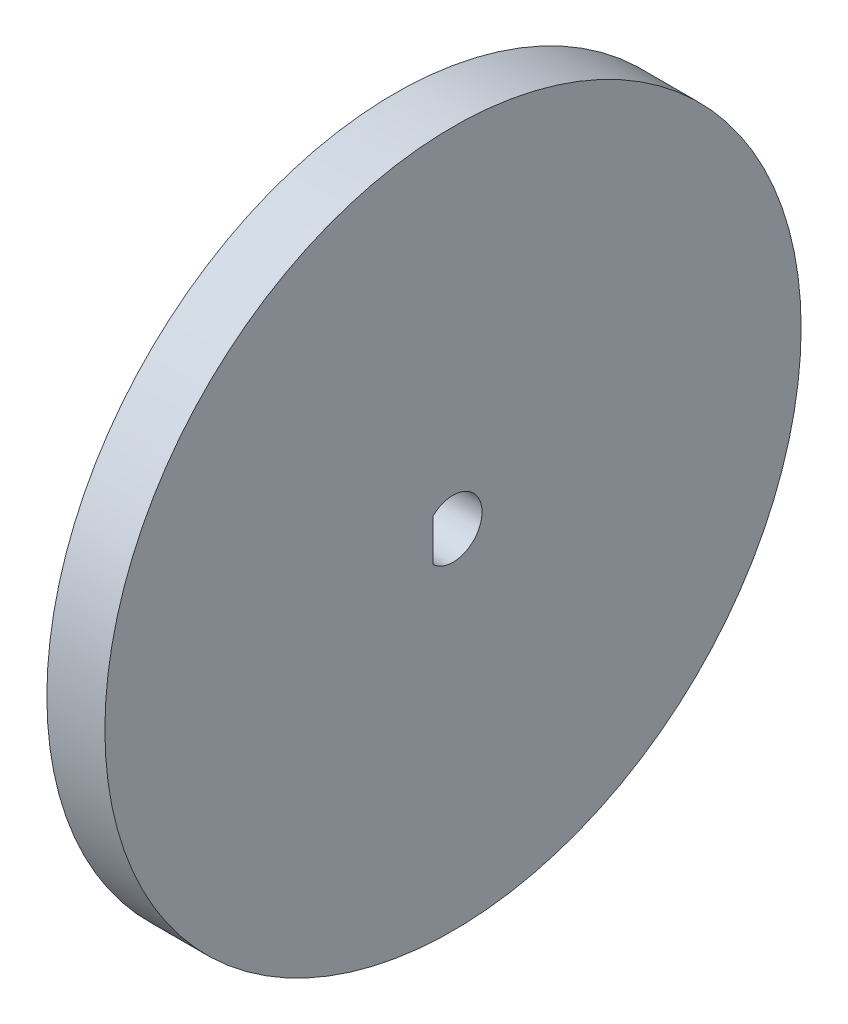
ISO-10303-21;
HEADER;
FILE_DESCRIPTION(('STEP AP214'),'2;1');
FILE_NAME('part.step','',(''),(''),'','','');
FILE_SCHEMA(('AUTOMOTIVE_DESIGN { 1 0 10303 214 1 1 1 1 }'));
ENDSEC;
DATA;
#1=APPLICATION_CONTEXT('core data for automotive mechanical design processes');
#2=APPLICATION_PROTOCOL_DEFINITION('international standard','automotive_design',2000,#1);
#3=PRODUCT_CONTEXT('',#1,'mechanical');
#4=PRODUCT('Part','Part','',(#3));
#5=PRODUCT_RELATED_PRODUCT_CATEGORY('part','',(#4));
#6=PRODUCT_DEFINITION_FORMATION('','',#4);
#7=PRODUCT_DEFINITION_CONTEXT('part definition',#1,'design');
#8=PRODUCT_DEFINITION('design','',#6,#7);
#9=PRODUCT_DEFINITION_SHAPE('','',#8);
#10=(LENGTH_UNIT() NAMED_UNIT(*) SI_UNIT(.MILLI.,.METRE.));
#11=(NAMED_UNIT(*) PLANE_ANGLE_UNIT() SI_UNIT($,.RADIAN.));
#12=(NAMED_UNIT(*) SI_UNIT($,.STERADIAN.) SOLID_ANGLE_UNIT());
#13=UNCERTAINTY_MEASURE_WITH_UNIT(LENGTH_MEASURE(1.E-05),#10,'distance_accuracy_value','');
#14=(GEOMETRIC_REPRESENTATION_CONTEXT(3) GLOBAL_UNCERTAINTY_ASSIGNED_CONTEXT((#13)) GLOBAL_UNIT_ASSIGNED_CONTEXT((#10,
#11,#12)) REPRESENTATION_CONTEXT('',''));
#15=CARTESIAN_POINT('',(0.,0.,0.));
#16=DIRECTION('',(0.,0.,1.));
#17=DIRECTION('',(1.,0.,0.));
#18=AXIS2_PLACEMENT_3D('',#15,#16,#17);
#19=CARTESIAN_POINT('',(6.35,0.,0.));
#20=DIRECTION('',(1.,0.,0.));
#21=DIRECTION('',(0.,0.,-1.));
#22=AXIS2_PLACEMENT_3D('',#19,#20,#21);
#23=PLANE('',#22);
#24=CARTESIAN_POINT('',(6.35,0.,0.));
#25=DIRECTION('',(1.,0.,0.));
#26=DIRECTION('',(0.,0.,-1.));
#27=AXIS2_PLACEMENT_3D('',#24,#25,#26);
#28=CIRCLE('',#27,38.1);
#29=CARTESIAN_POINT('',(6.35,0.,-38.1));
#30=VERTEX_POINT('',#29);
#31=EDGE_CURVE('E11',#30,#30,#28,.T.);
#32=ORIENTED_EDGE('',*,*,#31,.T.);
#33=EDGE_LOOP('',(#32));
#34=FACE_BOUND('',#33,.T.);
#35=DIRECTION('',(0.,-1.,0.));
#36=VECTOR('',#35,1.);
#37=CARTESIAN_POINT('',(6.35,2.30413142854309,2.1844));
#38=LINE('',#37,#36);
#39=CARTESIAN_POINT('',(6.35,2.30413142854309,2.1844));
#40=VERTEX_POINT('',#39);
#41=CARTESIAN_POINT('',(6.35,-2.30413142854309,2.1844));
#42=VERTEX_POINT('',#41);
#43=EDGE_CURVE('E74',#40,#42,#38,.T.);
#44=ORIENTED_EDGE('',*,*,#43,.F.);
#45=CARTESIAN_POINT('',(6.35,0.,0.));
#46=DIRECTION('',(1.,0.,0.));
#47=DIRECTION('',(0.,0.,-1.));
#48=AXIS2_PLACEMENT_3D('',#45,#46,#47);
#49=CIRCLE('',#48,3.175);
#50=EDGE_CURVE('E65',#42,#40,#49,.T.);
#51=ORIENTED_EDGE('',*,*,#50,.F.);
#52=EDGE_LOOP('',(#44,#51));
#53=FACE_BOUND('',#52,.T.);
#54=ADVANCED_FACE('F33',(#34,#53),#23,.T.);
#55=CARTESIAN_POINT('',(0.,0.,0.));
#56=DIRECTION('',(1.,0.,0.));
#57=DIRECTION('',(0.,0.,-1.));
#58=AXIS2_PLACEMENT_3D('',#55,#56,#57);
#59=PLANE('',#58);
#60=CARTESIAN_POINT('',(0.,0.,0.));
#61=DIRECTION('',(1.,0.,0.));
#62=DIRECTION('',(0.,0.,-1.));
#63=AXIS2_PLACEMENT_3D('',#60,#61,#62);
#64=CIRCLE('',#63,38.1);
#65=CARTESIAN_POINT('',(0.,0.,-38.1));
#66=VERTEX_POINT('',#65);
#67=EDGE_CURVE('E37',#66,#66,#64,.T.);
#68=ORIENTED_EDGE('',*,*,#67,.F.);
#69=EDGE_LOOP('',(#68));
#70=FACE_BOUND('',#69,.T.);
#71=CARTESIAN_POINT('',(0.,0.,0.));
#72=DIRECTION('',(1.,0.,0.));
#73=DIRECTION('',(0.,0.,-1.));
#74=AXIS2_PLACEMENT_3D('',#71,#72,#73);
#75=CIRCLE('',#74,3.175);
#76=CARTESIAN_POINT('',(0.,-2.30413142854309,2.1844));
#77=VERTEX_POINT('',#76);
#78=CARTESIAN_POINT('',(0.,2.30413142854309,2.1844));
#79=VERTEX_POINT('',#78);
#80=EDGE_CURVE('E55',#77,#79,#75,.T.);
#81=ORIENTED_EDGE('',*,*,#80,.T.);
#82=DIRECTION('',(0.,-1.,0.));
#83=VECTOR('',#82,1.);
#84=CARTESIAN_POINT('',(0.,2.30413142854309,2.1844));
#85=LINE('',#84,#83);
#86=EDGE_CURVE('E61',#79,#77,#85,.T.);
#87=ORIENTED_EDGE('',*,*,#86,.T.);
#88=EDGE_LOOP('',(#81,#87));
#89=FACE_BOUND('',#88,.T.);
#90=ADVANCED_FACE('F71',(#70,#89),#59,.F.);
#91=CARTESIAN_POINT('',(6.35,0.,0.));
#92=DIRECTION('',(-1.,0.,0.));
#93=DIRECTION('',(0.,0.,1.));
#94=AXIS2_PLACEMENT_3D('',#91,#92,#93);
#95=CYLINDRICAL_SURFACE('',#94,38.1);
#96=ORIENTED_EDGE('',*,*,#31,.F.);
#97=EDGE_LOOP('',(#96));
#98=FACE_BOUND('',#97,.T.);
#99=ORIENTED_EDGE('',*,*,#67,.T.);
#100=EDGE_LOOP('',(#99));
#101=FACE_BOUND('',#100,.T.);
#102=ADVANCED_FACE('F35',(#98,#101),#95,.T.);
#103=CARTESIAN_POINT('',(6.35,0.,0.));
#104=DIRECTION('',(-1.,0.,0.));
#105=DIRECTION('',(0.,0.,1.));
#106=AXIS2_PLACEMENT_3D('',#103,#104,#105);
#107=CYLINDRICAL_SURFACE('',#106,3.175);
#108=ORIENTED_EDGE('',*,*,#80,.F.);
#109=DIRECTION('',(-1.,0.,0.));
#110=VECTOR('',#109,1.);
#111=CARTESIAN_POINT('',(6.35,-2.30413142854309,2.1844));
#112=LINE('',#111,#110);
#113=EDGE_CURVE('E63',#42,#77,#112,.T.);
#114=ORIENTED_EDGE('',*,*,#113,.F.);
#115=ORIENTED_EDGE('',*,*,#50,.T.);
#116=DIRECTION('',(-1.,0.,0.));
#117=VECTOR('',#116,1.);
#118=CARTESIAN_POINT('',(6.35,2.30413142854309,2.1844));
#119=LINE('',#118,#117);
#120=EDGE_CURVE('E48',#40,#79,#119,.T.);
#121=ORIENTED_EDGE('',*,*,#120,.T.);
#122=EDGE_LOOP('',(#108,#114,#115,#121));
#123=FACE_BOUND('',#122,.T.);
#124=ADVANCED_FACE('F67',(#123),#107,.F.);
#125=CARTESIAN_POINT('',(6.35,2.30413142854309,2.1844));
#126=DIRECTION('',(0.,0.,-1.));
#127=DIRECTION('',(-1.,0.,0.));
#128=AXIS2_PLACEMENT_3D('',#125,#126,#127);
#129=PLANE('',#128);
#130=ORIENTED_EDGE('',*,*,#86,.F.);
#131=ORIENTED_EDGE('',*,*,#120,.F.);
#132=ORIENTED_EDGE('',*,*,#43,.T.);
#133=ORIENTED_EDGE('',*,*,#113,.T.);
#134=EDGE_LOOP('',(#130,#131,#132,#133));
#135=FACE_BOUND('',#134,.T.);
#136=ADVANCED_FACE('F62',(#135),#129,.T.);
#137=CLOSED_SHELL('',(#54,#90,#102,#124,#136));
#138=MANIFOLD_SOLID_BREP('B2',#137);
#139=ADVANCED_BREP_SHAPE_REPRESENTATION('',(#18,#138),#14);
#140=SHAPE_DEFINITION_REPRESENTATION(#9,#139);
ENDSEC;
END-ISO-10303-21;
